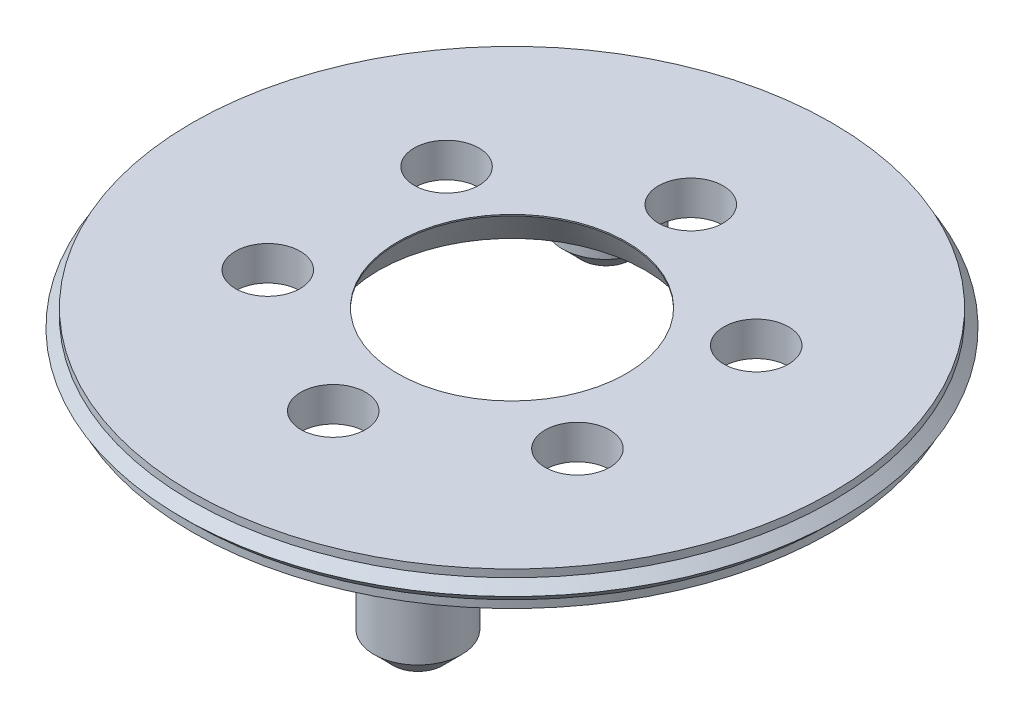
ISO-10303-21;
HEADER;
FILE_DESCRIPTION(('STEP AP214'),'2;1');
FILE_NAME('part.step','',(''),(''),'','','');
FILE_SCHEMA(('AUTOMOTIVE_DESIGN { 1 0 10303 214 1 1 1 1 }'));
ENDSEC;
DATA;
#1=APPLICATION_CONTEXT('core data for automotive mechanical design processes');
#2=APPLICATION_PROTOCOL_DEFINITION('international standard','automotive_design',2000,#1);
#3=PRODUCT_CONTEXT('',#1,'mechanical');
#4=PRODUCT('Part','Part','',(#3));
#5=PRODUCT_RELATED_PRODUCT_CATEGORY('part','',(#4));
#6=PRODUCT_DEFINITION_FORMATION('','',#4);
#7=PRODUCT_DEFINITION_CONTEXT('part definition',#1,'design');
#8=PRODUCT_DEFINITION('design','',#6,#7);
#9=PRODUCT_DEFINITION_SHAPE('','',#8);
#10=(LENGTH_UNIT() NAMED_UNIT(*) SI_UNIT(.MILLI.,.METRE.));
#11=(NAMED_UNIT(*) PLANE_ANGLE_UNIT() SI_UNIT($,.RADIAN.));
#12=(NAMED_UNIT(*) SI_UNIT($,.STERADIAN.) SOLID_ANGLE_UNIT());
#13=UNCERTAINTY_MEASURE_WITH_UNIT(LENGTH_MEASURE(1.E-05),#10,'distance_accuracy_value','');
#14=(GEOMETRIC_REPRESENTATION_CONTEXT(3) GLOBAL_UNCERTAINTY_ASSIGNED_CONTEXT((#13)) GLOBAL_UNIT_ASSIGNED_CONTEXT((#10,
#11,#12)) REPRESENTATION_CONTEXT('',''));
#15=CARTESIAN_POINT('',(0.,0.,0.));
#16=DIRECTION('',(0.,0.,1.));
#17=DIRECTION('',(1.,0.,0.));
#18=AXIS2_PLACEMENT_3D('',#15,#16,#17);
#19=CARTESIAN_POINT('',(6.01004949616128E-13,-175.207382849277,0.));
#20=DIRECTION('',(0.,-1.,0.));
#21=DIRECTION('',(1.,0.,0.));
#22=AXIS2_PLACEMENT_3D('',#19,#20,#21);
#23=CYLINDRICAL_SURFACE('',#22,6.);
#24=CARTESIAN_POINT('',(0.,0.832050807568846,0.));
#25=DIRECTION('',(0.,-1.,0.));
#26=DIRECTION('',(1.,0.,0.));
#27=AXIS2_PLACEMENT_3D('',#24,#25,#26);
#28=CIRCLE('',#27,6.);
#29=CARTESIAN_POINT('',(6.,0.832050807568867,0.));
#30=VERTEX_POINT('',#29);
#31=EDGE_CURVE('E51',#30,#30,#28,.T.);
#32=ORIENTED_EDGE('',*,*,#31,.T.);
#33=EDGE_LOOP('',(#32));
#34=FACE_BOUND('',#33,.T.);
#35=CARTESIAN_POINT('',(0.,0.899999999999984,0.));
#36=DIRECTION('',(0.,-1.,0.));
#37=DIRECTION('',(1.,0.,0.));
#38=AXIS2_PLACEMENT_3D('',#35,#36,#37);
#39=CIRCLE('',#38,6.);
#40=CARTESIAN_POINT('',(6.,0.900000000000005,0.));
#41=VERTEX_POINT('',#40);
#42=EDGE_CURVE('E85',#41,#41,#39,.T.);
#43=ORIENTED_EDGE('',*,*,#42,.F.);
#44=EDGE_LOOP('',(#43));
#45=FACE_BOUND('',#44,.T.);
#46=ADVANCED_FACE('F43',(#34,#45),#23,.F.);
#47=CARTESIAN_POINT('',(6.,-0.900000000000018,0.));
#48=DIRECTION('',(0.,-1.,0.));
#49=DIRECTION('',(1.,0.,0.));
#50=AXIS2_PLACEMENT_3D('',#47,#48,#49);
#51=PLANE('',#50);
#52=CARTESIAN_POINT('',(0.,-0.900000000000038,0.));
#53=DIRECTION('',(0.,-1.,0.));
#54=DIRECTION('',(1.,0.,0.));
#55=AXIS2_PLACEMENT_3D('',#52,#53,#54);
#56=CIRCLE('',#55,7.00000000000001);
#57=CARTESIAN_POINT('',(7.00000000000001,-0.900000000000014,0.));
#58=VERTEX_POINT('',#57);
#59=EDGE_CURVE('E10',#58,#58,#56,.F.);
#60=ORIENTED_EDGE('',*,*,#59,.T.);
#61=EDGE_LOOP('',(#60));
#62=FACE_BOUND('',#61,.T.);
#63=CARTESIAN_POINT('',(6.74999999999997,-0.900000000000015,11.6913429510899));
#64=DIRECTION('',(0.,-1.,0.));
#65=DIRECTION('',(1.,0.,0.));
#66=AXIS2_PLACEMENT_3D('',#63,#64,#65);
#67=CIRCLE('',#66,2.3);
#68=CARTESIAN_POINT('',(9.04999999999997,-0.900000000000007,11.6913429510899));
#69=VERTEX_POINT('',#68);
#70=EDGE_CURVE('E118',#69,#69,#67,.T.);
#71=ORIENTED_EDGE('',*,*,#70,.F.);
#72=EDGE_LOOP('',(#71));
#73=FACE_BOUND('',#72,.T.);
#74=CARTESIAN_POINT('',(-6.74999999999997,-0.900000000000062,-11.6913429510899));
#75=DIRECTION('',(0.,-1.,0.));
#76=DIRECTION('',(1.,0.,0.));
#77=AXIS2_PLACEMENT_3D('',#74,#75,#76);
#78=CIRCLE('',#77,2.3);
#79=CARTESIAN_POINT('',(-4.44999999999997,-0.900000000000054,-11.6913429510899));
#80=VERTEX_POINT('',#79);
#81=EDGE_CURVE('E125',#80,#80,#78,.T.);
#82=ORIENTED_EDGE('',*,*,#81,.F.);
#83=EDGE_LOOP('',(#82));
#84=FACE_BOUND('',#83,.T.);
#85=CARTESIAN_POINT('',(0.,-0.900000000000079,-9.385));
#86=DIRECTION('',(0.,1.,0.));
#87=DIRECTION('',(-1.,0.,0.));
#88=AXIS2_PLACEMENT_3D('',#85,#86,#87);
#89=CIRCLE('',#88,1.7);
#90=CARTESIAN_POINT('',(-1.7,-0.900000000000084,-9.385));
#91=VERTEX_POINT('',#90);
#92=EDGE_CURVE('E88',#91,#91,#89,.T.);
#93=ORIENTED_EDGE('',*,*,#92,.T.);
#94=EDGE_LOOP('',(#93));
#95=FACE_BOUND('',#94,.T.);
#96=CARTESIAN_POINT('',(-8.12764841451695,-0.900000000000106,-4.69249999999999));
#97=DIRECTION('',(0.,1.,0.));
#98=DIRECTION('',(-1.,0.,0.));
#99=AXIS2_PLACEMENT_3D('',#96,#97,#98);
#100=CIRCLE('',#99,1.7);
#101=CARTESIAN_POINT('',(-9.82764841451696,-0.900000000000112,-4.69249999999999));
#102=VERTEX_POINT('',#101);
#103=EDGE_CURVE('E115',#102,#102,#100,.T.);
#104=ORIENTED_EDGE('',*,*,#103,.T.);
#105=EDGE_LOOP('',(#104));
#106=FACE_BOUND('',#105,.T.);
#107=CARTESIAN_POINT('',(-8.12764841451695,-0.900000000000106,4.6925));
#108=DIRECTION('',(0.,1.,0.));
#109=DIRECTION('',(-1.,0.,0.));
#110=AXIS2_PLACEMENT_3D('',#107,#108,#109);
#111=CIRCLE('',#110,1.7);
#112=CARTESIAN_POINT('',(-9.82764841451695,-0.900000000000112,4.6925));
#113=VERTEX_POINT('',#112);
#114=EDGE_CURVE('E89',#113,#113,#111,.T.);
#115=ORIENTED_EDGE('',*,*,#114,.T.);
#116=EDGE_LOOP('',(#115));
#117=FACE_BOUND('',#116,.T.);
#118=CARTESIAN_POINT('',(0.,-0.900000000000079,9.385));
#119=DIRECTION('',(0.,1.,0.));
#120=DIRECTION('',(-1.,0.,0.));
#121=AXIS2_PLACEMENT_3D('',#118,#119,#120);
#122=CIRCLE('',#121,1.7);
#123=CARTESIAN_POINT('',(-1.69999999999999,-0.900000000000084,9.385));
#124=VERTEX_POINT('',#123);
#125=EDGE_CURVE('E96',#124,#124,#122,.T.);
#126=ORIENTED_EDGE('',*,*,#125,.T.);
#127=EDGE_LOOP('',(#126));
#128=FACE_BOUND('',#127,.T.);
#129=CARTESIAN_POINT('',(8.12764841451696,-0.900000000000051,4.6925));
#130=DIRECTION('',(0.,1.,0.));
#131=DIRECTION('',(-1.,0.,0.));
#132=AXIS2_PLACEMENT_3D('',#129,#130,#131);
#133=CIRCLE('',#132,1.7);
#134=CARTESIAN_POINT('',(6.42764841451696,-0.900000000000057,4.6925));
#135=VERTEX_POINT('',#134);
#136=EDGE_CURVE('E102',#135,#135,#133,.T.);
#137=ORIENTED_EDGE('',*,*,#136,.T.);
#138=EDGE_LOOP('',(#137));
#139=FACE_BOUND('',#138,.T.);
#140=CARTESIAN_POINT('',(8.12764841451696,-0.900000000000051,-4.6925));
#141=DIRECTION('',(0.,1.,0.));
#142=DIRECTION('',(-1.,0.,0.));
#143=AXIS2_PLACEMENT_3D('',#140,#141,#142);
#144=CIRCLE('',#143,1.7);
#145=CARTESIAN_POINT('',(6.42764841451696,-0.900000000000057,-4.6925));
#146=VERTEX_POINT('',#145);
#147=EDGE_CURVE('E108',#146,#146,#144,.T.);
#148=ORIENTED_EDGE('',*,*,#147,.T.);
#149=EDGE_LOOP('',(#148));
#150=FACE_BOUND('',#149,.T.);
#151=CARTESIAN_POINT('',(0.,-0.900000000000067,0.));
#152=DIRECTION('',(0.,-1.,0.));
#153=DIRECTION('',(1.,0.,0.));
#154=AXIS2_PLACEMENT_3D('',#151,#152,#153);
#155=CIRCLE('',#154,16.8);
#156=CARTESIAN_POINT('',(16.8,-0.90000000000001,0.));
#157=VERTEX_POINT('',#156);
#158=EDGE_CURVE('E70',#157,#157,#155,.T.);
#159=ORIENTED_EDGE('',*,*,#158,.T.);
#160=EDGE_LOOP('',(#159));
#161=FACE_BOUND('',#160,.T.);
#162=ADVANCED_FACE('F133',(#62,#73,#84,#95,#106,#117,#128,#139,#150,#161),#51,.T.);
#163=CARTESIAN_POINT('',(6.01004949616128E-13,-175.207382849277,0.));
#164=DIRECTION('',(0.,-1.,0.));
#165=DIRECTION('',(1.,0.,0.));
#166=AXIS2_PLACEMENT_3D('',#163,#164,#165);
#167=CYLINDRICAL_SURFACE('',#166,16.8);
#168=CARTESIAN_POINT('',(0.,-0.500000000000056,0.));
#169=DIRECTION('',(0.,-1.,0.));
#170=DIRECTION('',(1.,0.,0.));
#171=AXIS2_PLACEMENT_3D('',#168,#169,#170);
#172=CIRCLE('',#171,16.8);
#173=CARTESIAN_POINT('',(16.8,-0.499999999999998,0.));
#174=VERTEX_POINT('',#173);
#175=EDGE_CURVE('E73',#174,#174,#172,.T.);
#176=ORIENTED_EDGE('',*,*,#175,.T.);
#177=EDGE_LOOP('',(#176));
#178=FACE_BOUND('',#177,.T.);
#179=ORIENTED_EDGE('',*,*,#158,.F.);
#180=EDGE_LOOP('',(#179));
#181=FACE_BOUND('',#180,.T.);
#182=ADVANCED_FACE('F136',(#178,#181),#167,.T.);
#183=CARTESIAN_POINT('',(0.,-0.500000000000056,0.));
#184=DIRECTION('',(0.,1.,0.));
#185=DIRECTION('',(-1.,0.,0.));
#186=AXIS2_PLACEMENT_3D('',#183,#184,#185);
#187=CONICAL_SURFACE('',#186,16.8,0.785398163397448);
#188=CARTESIAN_POINT('',(0.,0.,0.));
#189=DIRECTION('',(0.,-1.,0.));
#190=DIRECTION('',(1.,0.,0.));
#191=AXIS2_PLACEMENT_3D('',#188,#189,#190);
#192=CIRCLE('',#191,17.3);
#193=CARTESIAN_POINT('',(17.3,0.,0.));
#194=VERTEX_POINT('',#193);
#195=EDGE_CURVE('E76',#194,#194,#192,.T.);
#196=ORIENTED_EDGE('',*,*,#195,.T.);
#197=EDGE_LOOP('',(#196));
#198=FACE_BOUND('',#197,.T.);
#199=ORIENTED_EDGE('',*,*,#175,.F.);
#200=EDGE_LOOP('',(#199));
#201=FACE_BOUND('',#200,.T.);
#202=ADVANCED_FACE('F155',(#198,#201),#187,.T.);
#203=CARTESIAN_POINT('',(0.,0.,0.));
#204=DIRECTION('',(0.,-1.,0.));
#205=DIRECTION('',(1.,0.,0.));
#206=AXIS2_PLACEMENT_3D('',#203,#204,#205);
#207=CONICAL_SURFACE('',#206,17.3,0.785398163397448);
#208=CARTESIAN_POINT('',(0.,0.499999999999945,0.));
#209=DIRECTION('',(0.,-1.,0.));
#210=DIRECTION('',(1.,0.,0.));
#211=AXIS2_PLACEMENT_3D('',#208,#209,#210);
#212=CIRCLE('',#211,16.8);
#213=CARTESIAN_POINT('',(16.8,0.500000000000003,0.));
#214=VERTEX_POINT('',#213);
#215=EDGE_CURVE('E79',#214,#214,#212,.T.);
#216=ORIENTED_EDGE('',*,*,#215,.T.);
#217=EDGE_LOOP('',(#216));
#218=FACE_BOUND('',#217,.T.);
#219=ORIENTED_EDGE('',*,*,#195,.F.);
#220=EDGE_LOOP('',(#219));
#221=FACE_BOUND('',#220,.T.);
#222=ADVANCED_FACE('F161',(#218,#221),#207,.T.);
#223=CARTESIAN_POINT('',(6.01004949616128E-13,-175.207382849277,0.));
#224=DIRECTION('',(0.,-1.,0.));
#225=DIRECTION('',(1.,0.,0.));
#226=AXIS2_PLACEMENT_3D('',#223,#224,#225);
#227=CYLINDRICAL_SURFACE('',#226,16.8);
#228=CARTESIAN_POINT('',(0.,0.899999999999956,0.));
#229=DIRECTION('',(0.,-1.,0.));
#230=DIRECTION('',(1.,0.,0.));
#231=AXIS2_PLACEMENT_3D('',#228,#229,#230);
#232=CIRCLE('',#231,16.8);
#233=CARTESIAN_POINT('',(16.8,0.900000000000014,0.));
#234=VERTEX_POINT('',#233);
#235=EDGE_CURVE('E82',#234,#234,#232,.T.);
#236=ORIENTED_EDGE('',*,*,#235,.T.);
#237=EDGE_LOOP('',(#236));
#238=FACE_BOUND('',#237,.T.);
#239=ORIENTED_EDGE('',*,*,#215,.F.);
#240=EDGE_LOOP('',(#239));
#241=FACE_BOUND('',#240,.T.);
#242=ADVANCED_FACE('F234',(#238,#241),#227,.T.);
#243=CARTESIAN_POINT('',(16.8,0.900000000000018,0.));
#244=DIRECTION('',(0.,1.,0.));
#245=DIRECTION('',(-1.,0.,0.));
#246=AXIS2_PLACEMENT_3D('',#243,#244,#245);
#247=PLANE('',#246);
#248=CARTESIAN_POINT('',(0.,0.89999999999996,-9.385));
#249=DIRECTION('',(0.,1.,0.));
#250=DIRECTION('',(-1.,0.,0.));
#251=AXIS2_PLACEMENT_3D('',#248,#249,#250);
#252=CIRCLE('',#251,1.7);
#253=CARTESIAN_POINT('',(-1.7,0.899999999999954,-9.385));
#254=VERTEX_POINT('',#253);
#255=EDGE_CURVE('E114',#254,#254,#252,.T.);
#256=ORIENTED_EDGE('',*,*,#255,.F.);
#257=EDGE_LOOP('',(#256));
#258=FACE_BOUND('',#257,.T.);
#259=CARTESIAN_POINT('',(-8.12764841451696,0.899999999999932,-4.69249999999999));
#260=DIRECTION('',(0.,1.,0.));
#261=DIRECTION('',(-1.,0.,0.));
#262=AXIS2_PLACEMENT_3D('',#259,#260,#261);
#263=CIRCLE('',#262,1.7);
#264=CARTESIAN_POINT('',(-9.82764841451696,0.899999999999926,-4.69249999999999));
#265=VERTEX_POINT('',#264);
#266=EDGE_CURVE('E93',#265,#265,#263,.T.);
#267=ORIENTED_EDGE('',*,*,#266,.F.);
#268=EDGE_LOOP('',(#267));
#269=FACE_BOUND('',#268,.T.);
#270=CARTESIAN_POINT('',(-8.12764841451696,0.899999999999932,4.6925));
#271=DIRECTION('',(0.,1.,0.));
#272=DIRECTION('',(-1.,0.,0.));
#273=AXIS2_PLACEMENT_3D('',#270,#271,#272);
#274=CIRCLE('',#273,1.7);
#275=CARTESIAN_POINT('',(-9.82764841451696,0.899999999999926,4.6925));
#276=VERTEX_POINT('',#275);
#277=EDGE_CURVE('E92',#276,#276,#274,.T.);
#278=ORIENTED_EDGE('',*,*,#277,.F.);
#279=EDGE_LOOP('',(#278));
#280=FACE_BOUND('',#279,.T.);
#281=CARTESIAN_POINT('',(0.,0.89999999999996,9.385));
#282=DIRECTION('',(0.,1.,0.));
#283=DIRECTION('',(-1.,0.,0.));
#284=AXIS2_PLACEMENT_3D('',#281,#282,#283);
#285=CIRCLE('',#284,1.7);
#286=CARTESIAN_POINT('',(-1.7,0.899999999999954,9.385));
#287=VERTEX_POINT('',#286);
#288=EDGE_CURVE('E99',#287,#287,#285,.T.);
#289=ORIENTED_EDGE('',*,*,#288,.F.);
#290=EDGE_LOOP('',(#289));
#291=FACE_BOUND('',#290,.T.);
#292=CARTESIAN_POINT('',(8.12764841451695,0.899999999999988,4.6925));
#293=DIRECTION('',(0.,1.,0.));
#294=DIRECTION('',(-1.,0.,0.));
#295=AXIS2_PLACEMENT_3D('',#292,#293,#294);
#296=CIRCLE('',#295,1.7);
#297=CARTESIAN_POINT('',(6.42764841451696,0.899999999999982,4.6925));
#298=VERTEX_POINT('',#297);
#299=EDGE_CURVE('E105',#298,#298,#296,.T.);
#300=ORIENTED_EDGE('',*,*,#299,.F.);
#301=EDGE_LOOP('',(#300));
#302=FACE_BOUND('',#301,.T.);
#303=CARTESIAN_POINT('',(8.12764841451695,0.899999999999988,-4.6925));
#304=DIRECTION('',(0.,1.,0.));
#305=DIRECTION('',(-1.,0.,0.));
#306=AXIS2_PLACEMENT_3D('',#303,#304,#305);
#307=CIRCLE('',#306,1.7);
#308=CARTESIAN_POINT('',(6.42764841451695,0.899999999999982,-4.6925));
#309=VERTEX_POINT('',#308);
#310=EDGE_CURVE('E111',#309,#309,#307,.T.);
#311=ORIENTED_EDGE('',*,*,#310,.F.);
#312=EDGE_LOOP('',(#311));
#313=FACE_BOUND('',#312,.T.);
#314=ORIENTED_EDGE('',*,*,#42,.T.);
#315=EDGE_LOOP('',(#314));
#316=FACE_BOUND('',#315,.T.);
#317=ORIENTED_EDGE('',*,*,#235,.F.);
#318=EDGE_LOOP('',(#317));
#319=FACE_BOUND('',#318,.T.);
#320=ADVANCED_FACE('F220',(#258,#269,#280,#291,#302,#313,#316,#319),#247,.T.);
#321=CARTESIAN_POINT('',(8.12764841451696,-0.900000000000051,-4.6925));
#322=DIRECTION('',(0.,1.,0.));
#323=DIRECTION('',(-1.,0.,0.));
#324=AXIS2_PLACEMENT_3D('',#321,#322,#323);
#325=CYLINDRICAL_SURFACE('',#324,1.7);
#326=ORIENTED_EDGE('',*,*,#147,.F.);
#327=EDGE_LOOP('',(#326));
#328=FACE_BOUND('',#327,.T.);
#329=ORIENTED_EDGE('',*,*,#310,.T.);
#330=EDGE_LOOP('',(#329));
#331=FACE_BOUND('',#330,.T.);
#332=ADVANCED_FACE('F216',(#328,#331),#325,.F.);
#333=CARTESIAN_POINT('',(8.12764841451696,-0.900000000000051,4.6925));
#334=DIRECTION('',(0.,1.,0.));
#335=DIRECTION('',(-1.,0.,0.));
#336=AXIS2_PLACEMENT_3D('',#333,#334,#335);
#337=CYLINDRICAL_SURFACE('',#336,1.7);
#338=ORIENTED_EDGE('',*,*,#136,.F.);
#339=EDGE_LOOP('',(#338));
#340=FACE_BOUND('',#339,.T.);
#341=ORIENTED_EDGE('',*,*,#299,.T.);
#342=EDGE_LOOP('',(#341));
#343=FACE_BOUND('',#342,.T.);
#344=ADVANCED_FACE('F219',(#340,#343),#337,.F.);
#345=CARTESIAN_POINT('',(0.,-0.900000000000079,9.385));
#346=DIRECTION('',(0.,1.,0.));
#347=DIRECTION('',(-1.,0.,0.));
#348=AXIS2_PLACEMENT_3D('',#345,#346,#347);
#349=CYLINDRICAL_SURFACE('',#348,1.7);
#350=ORIENTED_EDGE('',*,*,#125,.F.);
#351=EDGE_LOOP('',(#350));
#352=FACE_BOUND('',#351,.T.);
#353=ORIENTED_EDGE('',*,*,#288,.T.);
#354=EDGE_LOOP('',(#353));
#355=FACE_BOUND('',#354,.T.);
#356=ADVANCED_FACE('F224',(#352,#355),#349,.F.);
#357=CARTESIAN_POINT('',(-8.12764841451695,-0.900000000000106,4.6925));
#358=DIRECTION('',(0.,1.,0.));
#359=DIRECTION('',(-1.,0.,0.));
#360=AXIS2_PLACEMENT_3D('',#357,#358,#359);
#361=CYLINDRICAL_SURFACE('',#360,1.7);
#362=ORIENTED_EDGE('',*,*,#114,.F.);
#363=EDGE_LOOP('',(#362));
#364=FACE_BOUND('',#363,.T.);
#365=ORIENTED_EDGE('',*,*,#277,.T.);
#366=EDGE_LOOP('',(#365));
#367=FACE_BOUND('',#366,.T.);
#368=ADVANCED_FACE('F214',(#364,#367),#361,.F.);
#369=CARTESIAN_POINT('',(-8.12764841451695,-0.900000000000106,-4.69249999999999));
#370=DIRECTION('',(0.,1.,0.));
#371=DIRECTION('',(-1.,0.,0.));
#372=AXIS2_PLACEMENT_3D('',#369,#370,#371);
#373=CYLINDRICAL_SURFACE('',#372,1.7);
#374=ORIENTED_EDGE('',*,*,#103,.F.);
#375=EDGE_LOOP('',(#374));
#376=FACE_BOUND('',#375,.T.);
#377=ORIENTED_EDGE('',*,*,#266,.T.);
#378=EDGE_LOOP('',(#377));
#379=FACE_BOUND('',#378,.T.);
#380=ADVANCED_FACE('F210',(#376,#379),#373,.F.);
#381=CARTESIAN_POINT('',(0.,-0.900000000000079,-9.385));
#382=DIRECTION('',(0.,1.,0.));
#383=DIRECTION('',(-1.,0.,0.));
#384=AXIS2_PLACEMENT_3D('',#381,#382,#383);
#385=CYLINDRICAL_SURFACE('',#384,1.7);
#386=ORIENTED_EDGE('',*,*,#92,.F.);
#387=EDGE_LOOP('',(#386));
#388=FACE_BOUND('',#387,.T.);
#389=ORIENTED_EDGE('',*,*,#255,.T.);
#390=EDGE_LOOP('',(#389));
#391=FACE_BOUND('',#390,.T.);
#392=ADVANCED_FACE('F203',(#388,#391),#385,.F.);
#393=CARTESIAN_POINT('',(-6.74999999999995,-5.50000000000006,-11.6913429510899));
#394=DIRECTION('',(0.,1.,0.));
#395=DIRECTION('',(-1.,0.,0.));
#396=AXIS2_PLACEMENT_3D('',#393,#394,#395);
#397=CYLINDRICAL_SURFACE('',#396,2.3);
#398=CARTESIAN_POINT('',(-6.74999999999995,-4.50000000000006,-11.6913429510899));
#399=DIRECTION('',(0.,-1.,0.));
#400=DIRECTION('',(1.,0.,0.));
#401=AXIS2_PLACEMENT_3D('',#398,#399,#400);
#402=CIRCLE('',#401,2.3);
#403=CARTESIAN_POINT('',(-4.44999999999995,-4.50000000000005,-11.6913429510899));
#404=VERTEX_POINT('',#403);
#405=EDGE_CURVE('E64',#404,#404,#402,.F.);
#406=ORIENTED_EDGE('',*,*,#405,.T.);
#407=EDGE_LOOP('',(#406));
#408=FACE_BOUND('',#407,.T.);
#409=ORIENTED_EDGE('',*,*,#81,.T.);
#410=EDGE_LOOP('',(#409));
#411=FACE_BOUND('',#410,.T.);
#412=ADVANCED_FACE('F200',(#408,#411),#397,.T.);
#413=CARTESIAN_POINT('',(-6.74999999999995,-5.50000000000006,-11.6913429510899));
#414=DIRECTION('',(0.,-1.,0.));
#415=DIRECTION('',(1.,0.,0.));
#416=AXIS2_PLACEMENT_3D('',#413,#414,#415);
#417=PLANE('',#416);
#418=CARTESIAN_POINT('',(-6.74999999999995,-5.50000000000006,-11.6913429510899));
#419=DIRECTION('',(0.,-1.,0.));
#420=DIRECTION('',(1.,0.,0.));
#421=AXIS2_PLACEMENT_3D('',#418,#419,#420);
#422=CIRCLE('',#421,1.30000000000001);
#423=CARTESIAN_POINT('',(-5.44999999999994,-5.50000000000006,-11.6913429510899));
#424=VERTEX_POINT('',#423);
#425=EDGE_CURVE('E67',#424,#424,#422,.T.);
#426=ORIENTED_EDGE('',*,*,#425,.T.);
#427=EDGE_LOOP('',(#426));
#428=FACE_BOUND('',#427,.T.);
#429=ADVANCED_FACE('F196',(#428),#417,.T.);
#430=CARTESIAN_POINT('',(6.74999999999999,-5.50000000000002,11.6913429510899));
#431=DIRECTION('',(0.,1.,0.));
#432=DIRECTION('',(-1.,0.,0.));
#433=AXIS2_PLACEMENT_3D('',#430,#431,#432);
#434=CYLINDRICAL_SURFACE('',#433,2.3);
#435=CARTESIAN_POINT('',(6.74999999999998,-4.50000000000001,11.6913429510899));
#436=DIRECTION('',(0.,-1.,0.));
#437=DIRECTION('',(1.,0.,0.));
#438=AXIS2_PLACEMENT_3D('',#435,#436,#437);
#439=CIRCLE('',#438,2.3);
#440=CARTESIAN_POINT('',(9.04999999999998,-4.50000000000001,11.6913429510899));
#441=VERTEX_POINT('',#440);
#442=EDGE_CURVE('E55',#441,#441,#439,.F.);
#443=ORIENTED_EDGE('',*,*,#442,.T.);
#444=EDGE_LOOP('',(#443));
#445=FACE_BOUND('',#444,.T.);
#446=ORIENTED_EDGE('',*,*,#70,.T.);
#447=EDGE_LOOP('',(#446));
#448=FACE_BOUND('',#447,.T.);
#449=ADVANCED_FACE('F131',(#445,#448),#434,.T.);
#450=CARTESIAN_POINT('',(6.74999999999999,-5.50000000000002,11.6913429510899));
#451=DIRECTION('',(0.,-1.,0.));
#452=DIRECTION('',(1.,0.,0.));
#453=AXIS2_PLACEMENT_3D('',#450,#451,#452);
#454=PLANE('',#453);
#455=CARTESIAN_POINT('',(6.74999999999999,-5.50000000000002,11.6913429510899));
#456=DIRECTION('',(0.,-1.,0.));
#457=DIRECTION('',(1.,0.,0.));
#458=AXIS2_PLACEMENT_3D('',#455,#456,#457);
#459=CIRCLE('',#458,1.3);
#460=CARTESIAN_POINT('',(8.04999999999999,-5.50000000000001,11.6913429510899));
#461=VERTEX_POINT('',#460);
#462=EDGE_CURVE('E59',#461,#461,#459,.T.);
#463=ORIENTED_EDGE('',*,*,#462,.T.);
#464=EDGE_LOOP('',(#463));
#465=FACE_BOUND('',#464,.T.);
#466=ADVANCED_FACE('F178',(#465),#454,.T.);
#467=CARTESIAN_POINT('',(-6.74999999999995,-5.50000000000006,-11.6913429510899));
#468=DIRECTION('',(0.,1.,0.));
#469=DIRECTION('',(-1.,0.,0.));
#470=AXIS2_PLACEMENT_3D('',#467,#468,#469);
#471=CONICAL_SURFACE('',#470,1.30000000000001,0.785398163397445);
#472=ORIENTED_EDGE('',*,*,#405,.F.);
#473=EDGE_LOOP('',(#472));
#474=FACE_BOUND('',#473,.T.);
#475=ORIENTED_EDGE('',*,*,#425,.F.);
#476=EDGE_LOOP('',(#475));
#477=FACE_BOUND('',#476,.T.);
#478=ADVANCED_FACE('F172',(#474,#477),#471,.T.);
#479=CARTESIAN_POINT('',(6.74999999999999,-5.50000000000002,11.6913429510899));
#480=DIRECTION('',(0.,1.,0.));
#481=DIRECTION('',(-1.,0.,0.));
#482=AXIS2_PLACEMENT_3D('',#479,#480,#481);
#483=CONICAL_SURFACE('',#482,1.3,0.785398163397446);
#484=ORIENTED_EDGE('',*,*,#442,.F.);
#485=EDGE_LOOP('',(#484));
#486=FACE_BOUND('',#485,.T.);
#487=ORIENTED_EDGE('',*,*,#462,.F.);
#488=EDGE_LOOP('',(#487));
#489=FACE_BOUND('',#488,.T.);
#490=ADVANCED_FACE('F177',(#486,#489),#483,.T.);
#491=CARTESIAN_POINT('',(0.,0.832050807568846,0.));
#492=DIRECTION('',(0.,-1.,0.));
#493=DIRECTION('',(1.,0.,0.));
#494=AXIS2_PLACEMENT_3D('',#491,#492,#493);
#495=CONICAL_SURFACE('',#494,6.,0.5235987755983);
#496=ORIENTED_EDGE('',*,*,#59,.F.);
#497=EDGE_LOOP('',(#496));
#498=FACE_BOUND('',#497,.T.);
#499=ORIENTED_EDGE('',*,*,#31,.F.);
#500=EDGE_LOOP('',(#499));
#501=FACE_BOUND('',#500,.T.);
#502=ADVANCED_FACE('F46',(#498,#501),#495,.F.);
#503=CLOSED_SHELL('',(#46,#162,#182,#202,#222,#242,#320,#332,#344,#356,#368,#380,#392,#412,#429,
#449,#466,#478,#490,#502));
#504=MANIFOLD_SOLID_BREP('B2',#503);
#505=ADVANCED_BREP_SHAPE_REPRESENTATION('',(#18,#504),#14);
#506=SHAPE_DEFINITION_REPRESENTATION(#9,#505);
ENDSEC;
END-ISO-10303-21;
